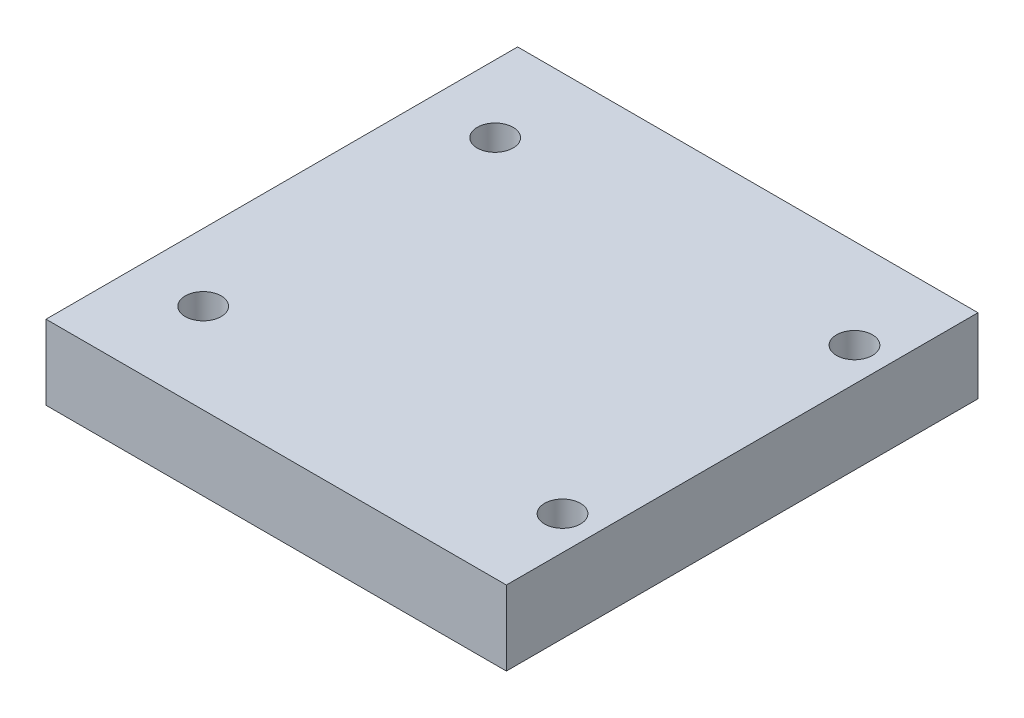
ISO-10303-21;
HEADER;
FILE_DESCRIPTION(('STEP AP214'),'2;1');
FILE_NAME('part.step','',(''),(''),'','','');
FILE_SCHEMA(('AUTOMOTIVE_DESIGN { 1 0 10303 214 1 1 1 1 }'));
ENDSEC;
DATA;
#1=APPLICATION_CONTEXT('core data for automotive mechanical design processes');
#2=APPLICATION_PROTOCOL_DEFINITION('international standard','automotive_design',2000,#1);
#3=PRODUCT_CONTEXT('',#1,'mechanical');
#4=PRODUCT('Part','Part','',(#3));
#5=PRODUCT_RELATED_PRODUCT_CATEGORY('part','',(#4));
#6=PRODUCT_DEFINITION_FORMATION('','',#4);
#7=PRODUCT_DEFINITION_CONTEXT('part definition',#1,'design');
#8=PRODUCT_DEFINITION('design','',#6,#7);
#9=PRODUCT_DEFINITION_SHAPE('','',#8);
#10=(LENGTH_UNIT() NAMED_UNIT(*) SI_UNIT(.MILLI.,.METRE.));
#11=(NAMED_UNIT(*) PLANE_ANGLE_UNIT() SI_UNIT($,.RADIAN.));
#12=(NAMED_UNIT(*) SI_UNIT($,.STERADIAN.) SOLID_ANGLE_UNIT());
#13=UNCERTAINTY_MEASURE_WITH_UNIT(LENGTH_MEASURE(1.E-05),#10,'distance_accuracy_value','');
#14=(GEOMETRIC_REPRESENTATION_CONTEXT(3) GLOBAL_UNCERTAINTY_ASSIGNED_CONTEXT((#13)) GLOBAL_UNIT_ASSIGNED_CONTEXT((#10,
#11,#12)) REPRESENTATION_CONTEXT('',''));
#15=CARTESIAN_POINT('',(0.,0.,0.));
#16=DIRECTION('',(0.,0.,1.));
#17=DIRECTION('',(1.,0.,0.));
#18=AXIS2_PLACEMENT_3D('',#15,#16,#17);
#19=CARTESIAN_POINT('',(-59.517248692373,10.541,24.9252097023032));
#20=DIRECTION('',(1.,0.,0.));
#21=DIRECTION('',(0.,0.,-1.));
#22=AXIS2_PLACEMENT_3D('',#19,#20,#21);
#23=PLANE('',#22);
#24=DIRECTION('',(0.,0.,1.));
#25=VECTOR('',#24,1.);
#26=CARTESIAN_POINT('',(-59.517248692373,0.,24.9252097023032));
#27=LINE('',#26,#25);
#28=CARTESIAN_POINT('',(-59.517248692373,0.,-41.7497902976968));
#29=VERTEX_POINT('',#28);
#30=CARTESIAN_POINT('',(-59.517248692373,0.,24.9252097023032));
#31=VERTEX_POINT('',#30);
#32=EDGE_CURVE('E96',#29,#31,#27,.T.);
#33=ORIENTED_EDGE('',*,*,#32,.T.);
#34=DIRECTION('',(0.,-1.,0.));
#35=VECTOR('',#34,1.);
#36=CARTESIAN_POINT('',(-59.517248692373,10.541,24.9252097023032));
#37=LINE('',#36,#35);
#38=CARTESIAN_POINT('',(-59.517248692373,10.541,24.9252097023032));
#39=VERTEX_POINT('',#38);
#40=EDGE_CURVE('E11',#39,#31,#37,.T.);
#41=ORIENTED_EDGE('',*,*,#40,.F.);
#42=DIRECTION('',(0.,0.,1.));
#43=VECTOR('',#42,1.);
#44=CARTESIAN_POINT('',(-59.517248692373,10.541,24.9252097023032));
#45=LINE('',#44,#43);
#46=CARTESIAN_POINT('',(-59.517248692373,10.541,-41.7497902976968));
#47=VERTEX_POINT('',#46);
#48=EDGE_CURVE('E84',#47,#39,#45,.T.);
#49=ORIENTED_EDGE('',*,*,#48,.F.);
#50=DIRECTION('',(0.,-1.,0.));
#51=VECTOR('',#50,1.);
#52=CARTESIAN_POINT('',(-59.517248692373,10.541,-41.7497902976968));
#53=LINE('',#52,#51);
#54=EDGE_CURVE('E92',#47,#29,#53,.T.);
#55=ORIENTED_EDGE('',*,*,#54,.T.);
#56=EDGE_LOOP('',(#33,#41,#49,#55));
#57=FACE_BOUND('',#56,.T.);
#58=ADVANCED_FACE('F33',(#57),#23,.F.);
#59=CARTESIAN_POINT('',(-59.517248692373,10.541,24.9252097023032));
#60=DIRECTION('',(0.,0.,-1.));
#61=DIRECTION('',(-1.,0.,0.));
#62=AXIS2_PLACEMENT_3D('',#59,#60,#61);
#63=PLANE('',#62);
#64=DIRECTION('',(1.,0.,0.));
#65=VECTOR('',#64,1.);
#66=CARTESIAN_POINT('',(-59.517248692373,0.,24.9252097023032));
#67=LINE('',#66,#65);
#68=CARTESIAN_POINT('',(5.57025130762703,0.,24.9252097023032));
#69=VERTEX_POINT('',#68);
#70=EDGE_CURVE('E88',#31,#69,#67,.T.);
#71=ORIENTED_EDGE('',*,*,#70,.T.);
#72=DIRECTION('',(0.,-1.,0.));
#73=VECTOR('',#72,1.);
#74=CARTESIAN_POINT('',(5.57025130762703,10.541,24.9252097023032));
#75=LINE('',#74,#73);
#76=CARTESIAN_POINT('',(5.57025130762703,10.541,24.9252097023032));
#77=VERTEX_POINT('',#76);
#78=EDGE_CURVE('E41',#77,#69,#75,.T.);
#79=ORIENTED_EDGE('',*,*,#78,.F.);
#80=DIRECTION('',(1.,0.,0.));
#81=VECTOR('',#80,1.);
#82=CARTESIAN_POINT('',(-59.517248692373,10.541,24.9252097023032));
#83=LINE('',#82,#81);
#84=EDGE_CURVE('E79',#39,#77,#83,.T.);
#85=ORIENTED_EDGE('',*,*,#84,.F.);
#86=ORIENTED_EDGE('',*,*,#40,.T.);
#87=EDGE_LOOP('',(#71,#79,#85,#86));
#88=FACE_BOUND('',#87,.T.);
#89=ADVANCED_FACE('F87',(#88),#63,.F.);
#90=CARTESIAN_POINT('',(5.57025130762703,10.541,24.9252097023032));
#91=DIRECTION('',(-1.,0.,0.));
#92=DIRECTION('',(0.,0.,1.));
#93=AXIS2_PLACEMENT_3D('',#90,#91,#92);
#94=PLANE('',#93);
#95=DIRECTION('',(0.,0.,-1.));
#96=VECTOR('',#95,1.);
#97=CARTESIAN_POINT('',(5.57025130762703,0.,24.9252097023032));
#98=LINE('',#97,#96);
#99=CARTESIAN_POINT('',(5.57025130762703,0.,-41.7497902976968));
#100=VERTEX_POINT('',#99);
#101=EDGE_CURVE('E66',#69,#100,#98,.T.);
#102=ORIENTED_EDGE('',*,*,#101,.T.);
#103=DIRECTION('',(0.,-1.,0.));
#104=VECTOR('',#103,1.);
#105=CARTESIAN_POINT('',(5.57025130762703,10.541,-41.7497902976968));
#106=LINE('',#105,#104);
#107=CARTESIAN_POINT('',(5.57025130762703,10.541,-41.7497902976968));
#108=VERTEX_POINT('',#107);
#109=EDGE_CURVE('E89',#108,#100,#106,.T.);
#110=ORIENTED_EDGE('',*,*,#109,.F.);
#111=DIRECTION('',(0.,0.,-1.));
#112=VECTOR('',#111,1.);
#113=CARTESIAN_POINT('',(5.57025130762703,10.541,24.9252097023032));
#114=LINE('',#113,#112);
#115=EDGE_CURVE('E82',#77,#108,#114,.T.);
#116=ORIENTED_EDGE('',*,*,#115,.F.);
#117=ORIENTED_EDGE('',*,*,#78,.T.);
#118=EDGE_LOOP('',(#102,#110,#116,#117));
#119=FACE_BOUND('',#118,.T.);
#120=ADVANCED_FACE('F90',(#119),#94,.F.);
#121=CARTESIAN_POINT('',(-59.517248692373,10.541,-41.7497902976968));
#122=DIRECTION('',(0.,0.,1.));
#123=DIRECTION('',(1.,0.,0.));
#124=AXIS2_PLACEMENT_3D('',#121,#122,#123);
#125=PLANE('',#124);
#126=DIRECTION('',(-1.,0.,0.));
#127=VECTOR('',#126,1.);
#128=CARTESIAN_POINT('',(-59.517248692373,0.,-41.7497902976968));
#129=LINE('',#128,#127);
#130=EDGE_CURVE('E72',#100,#29,#129,.T.);
#131=ORIENTED_EDGE('',*,*,#130,.T.);
#132=ORIENTED_EDGE('',*,*,#54,.F.);
#133=DIRECTION('',(-1.,0.,0.));
#134=VECTOR('',#133,1.);
#135=CARTESIAN_POINT('',(-59.517248692373,10.541,-41.7497902976968));
#136=LINE('',#135,#134);
#137=EDGE_CURVE('E49',#108,#47,#136,.T.);
#138=ORIENTED_EDGE('',*,*,#137,.F.);
#139=ORIENTED_EDGE('',*,*,#109,.T.);
#140=EDGE_LOOP('',(#131,#132,#138,#139));
#141=FACE_BOUND('',#140,.T.);
#142=ADVANCED_FACE('F104',(#141),#125,.F.);
#143=CARTESIAN_POINT('',(0.,10.541,0.));
#144=DIRECTION('',(0.,-1.,0.));
#145=DIRECTION('',(0.,0.,-1.));
#146=AXIS2_PLACEMENT_3D('',#143,#144,#145);
#147=PLANE('',#146);
#148=CARTESIAN_POINT('',(0.807751307627037,10.541,-29.0497902976968));
#149=DIRECTION('',(0.,-1.,0.));
#150=DIRECTION('',(0.,0.,-1.));
#151=AXIS2_PLACEMENT_3D('',#148,#149,#150);
#152=CIRCLE('',#151,2.54);
#153=CARTESIAN_POINT('',(0.807751307627037,10.541,-31.5897902976968));
#154=VERTEX_POINT('',#153);
#155=EDGE_CURVE('E99',#154,#154,#152,.T.);
#156=ORIENTED_EDGE('',*,*,#155,.T.);
#157=EDGE_LOOP('',(#156));
#158=FACE_BOUND('',#157,.T.);
#159=CARTESIAN_POINT('',(-49.992248692373,10.541,12.2252097023032));
#160=DIRECTION('',(0.,-1.,0.));
#161=DIRECTION('',(0.,0.,-1.));
#162=AXIS2_PLACEMENT_3D('',#159,#160,#161);
#163=CIRCLE('',#162,2.54);
#164=CARTESIAN_POINT('',(-49.992248692373,10.541,9.68520970230316));
#165=VERTEX_POINT('',#164);
#166=EDGE_CURVE('E112',#165,#165,#163,.T.);
#167=ORIENTED_EDGE('',*,*,#166,.T.);
#168=EDGE_LOOP('',(#167));
#169=FACE_BOUND('',#168,.T.);
#170=CARTESIAN_POINT('',(0.807751307627037,10.541,12.2252097023032));
#171=DIRECTION('',(0.,-1.,0.));
#172=DIRECTION('',(0.,0.,-1.));
#173=AXIS2_PLACEMENT_3D('',#170,#171,#172);
#174=CIRCLE('',#173,2.54);
#175=CARTESIAN_POINT('',(0.807751307627037,10.541,9.68520970230316));
#176=VERTEX_POINT('',#175);
#177=EDGE_CURVE('E115',#176,#176,#174,.T.);
#178=ORIENTED_EDGE('',*,*,#177,.T.);
#179=EDGE_LOOP('',(#178));
#180=FACE_BOUND('',#179,.T.);
#181=CARTESIAN_POINT('',(-49.992248692373,10.541,-29.0497902976968));
#182=DIRECTION('',(0.,-1.,0.));
#183=DIRECTION('',(0.,0.,-1.));
#184=AXIS2_PLACEMENT_3D('',#181,#182,#183);
#185=CIRCLE('',#184,2.54);
#186=CARTESIAN_POINT('',(-49.992248692373,10.541,-31.5897902976968));
#187=VERTEX_POINT('',#186);
#188=EDGE_CURVE('E118',#187,#187,#185,.T.);
#189=ORIENTED_EDGE('',*,*,#188,.T.);
#190=EDGE_LOOP('',(#189));
#191=FACE_BOUND('',#190,.T.);
#192=ORIENTED_EDGE('',*,*,#48,.T.);
#193=ORIENTED_EDGE('',*,*,#84,.T.);
#194=ORIENTED_EDGE('',*,*,#115,.T.);
#195=ORIENTED_EDGE('',*,*,#137,.T.);
#196=EDGE_LOOP('',(#192,#193,#194,#195));
#197=FACE_BOUND('',#196,.T.);
#198=ADVANCED_FACE('F80',(#158,#169,#180,#191,#197),#147,.F.);
#199=CARTESIAN_POINT('',(0.,0.,0.));
#200=DIRECTION('',(0.,-1.,0.));
#201=DIRECTION('',(0.,0.,-1.));
#202=AXIS2_PLACEMENT_3D('',#199,#200,#201);
#203=PLANE('',#202);
#204=CARTESIAN_POINT('',(0.807751307627037,0.,-29.0497902976968));
#205=DIRECTION('',(0.,1.,0.));
#206=DIRECTION('',(0.,0.,1.));
#207=AXIS2_PLACEMENT_3D('',#204,#205,#206);
#208=CIRCLE('',#207,2.54);
#209=CARTESIAN_POINT('',(0.807751307627037,0.,-26.5097902976968));
#210=VERTEX_POINT('',#209);
#211=EDGE_CURVE('E124',#210,#210,#208,.T.);
#212=ORIENTED_EDGE('',*,*,#211,.T.);
#213=EDGE_LOOP('',(#212));
#214=FACE_BOUND('',#213,.T.);
#215=CARTESIAN_POINT('',(-49.992248692373,0.,12.2252097023032));
#216=DIRECTION('',(0.,1.,0.));
#217=DIRECTION('',(0.,0.,1.));
#218=AXIS2_PLACEMENT_3D('',#215,#216,#217);
#219=CIRCLE('',#218,2.54);
#220=CARTESIAN_POINT('',(-49.992248692373,0.,14.7652097023032));
#221=VERTEX_POINT('',#220);
#222=EDGE_CURVE('E125',#221,#221,#219,.T.);
#223=ORIENTED_EDGE('',*,*,#222,.T.);
#224=EDGE_LOOP('',(#223));
#225=FACE_BOUND('',#224,.T.);
#226=CARTESIAN_POINT('',(0.807751307627037,0.,12.2252097023032));
#227=DIRECTION('',(0.,1.,0.));
#228=DIRECTION('',(0.,0.,1.));
#229=AXIS2_PLACEMENT_3D('',#226,#227,#228);
#230=CIRCLE('',#229,2.54);
#231=CARTESIAN_POINT('',(0.807751307627037,0.,14.7652097023032));
#232=VERTEX_POINT('',#231);
#233=EDGE_CURVE('E128',#232,#232,#230,.T.);
#234=ORIENTED_EDGE('',*,*,#233,.T.);
#235=EDGE_LOOP('',(#234));
#236=FACE_BOUND('',#235,.T.);
#237=CARTESIAN_POINT('',(-49.992248692373,0.,-29.0497902976968));
#238=DIRECTION('',(0.,1.,0.));
#239=DIRECTION('',(0.,0.,1.));
#240=AXIS2_PLACEMENT_3D('',#237,#238,#239);
#241=CIRCLE('',#240,2.54);
#242=CARTESIAN_POINT('',(-49.992248692373,0.,-26.5097902976968));
#243=VERTEX_POINT('',#242);
#244=EDGE_CURVE('E121',#243,#243,#241,.T.);
#245=ORIENTED_EDGE('',*,*,#244,.T.);
#246=EDGE_LOOP('',(#245));
#247=FACE_BOUND('',#246,.T.);
#248=ORIENTED_EDGE('',*,*,#32,.F.);
#249=ORIENTED_EDGE('',*,*,#130,.F.);
#250=ORIENTED_EDGE('',*,*,#101,.F.);
#251=ORIENTED_EDGE('',*,*,#70,.F.);
#252=EDGE_LOOP('',(#248,#249,#250,#251));
#253=FACE_BOUND('',#252,.T.);
#254=ADVANCED_FACE('F107',(#214,#225,#236,#247,#253),#203,.T.);
#255=CARTESIAN_POINT('',(-49.992248692373,0.,-29.0497902976968));
#256=DIRECTION('',(0.,1.,0.));
#257=DIRECTION('',(0.,0.,1.));
#258=AXIS2_PLACEMENT_3D('',#255,#256,#257);
#259=CYLINDRICAL_SURFACE('',#258,2.54);
#260=ORIENTED_EDGE('',*,*,#244,.F.);
#261=EDGE_LOOP('',(#260));
#262=FACE_BOUND('',#261,.T.);
#263=ORIENTED_EDGE('',*,*,#188,.F.);
#264=EDGE_LOOP('',(#263));
#265=FACE_BOUND('',#264,.T.);
#266=ADVANCED_FACE('F140',(#262,#265),#259,.F.);
#267=CARTESIAN_POINT('',(0.807751307627037,0.,12.2252097023032));
#268=DIRECTION('',(0.,1.,0.));
#269=DIRECTION('',(0.,0.,1.));
#270=AXIS2_PLACEMENT_3D('',#267,#268,#269);
#271=CYLINDRICAL_SURFACE('',#270,2.54);
#272=ORIENTED_EDGE('',*,*,#233,.F.);
#273=EDGE_LOOP('',(#272));
#274=FACE_BOUND('',#273,.T.);
#275=ORIENTED_EDGE('',*,*,#177,.F.);
#276=EDGE_LOOP('',(#275));
#277=FACE_BOUND('',#276,.T.);
#278=ADVANCED_FACE('F136',(#274,#277),#271,.F.);
#279=CARTESIAN_POINT('',(-49.992248692373,0.,12.2252097023032));
#280=DIRECTION('',(0.,1.,0.));
#281=DIRECTION('',(0.,0.,1.));
#282=AXIS2_PLACEMENT_3D('',#279,#280,#281);
#283=CYLINDRICAL_SURFACE('',#282,2.54);
#284=ORIENTED_EDGE('',*,*,#222,.F.);
#285=EDGE_LOOP('',(#284));
#286=FACE_BOUND('',#285,.T.);
#287=ORIENTED_EDGE('',*,*,#166,.F.);
#288=EDGE_LOOP('',(#287));
#289=FACE_BOUND('',#288,.T.);
#290=ADVANCED_FACE('F139',(#286,#289),#283,.F.);
#291=CARTESIAN_POINT('',(0.807751307627037,0.,-29.0497902976968));
#292=DIRECTION('',(0.,1.,0.));
#293=DIRECTION('',(0.,0.,1.));
#294=AXIS2_PLACEMENT_3D('',#291,#292,#293);
#295=CYLINDRICAL_SURFACE('',#294,2.54);
#296=ORIENTED_EDGE('',*,*,#211,.F.);
#297=EDGE_LOOP('',(#296));
#298=FACE_BOUND('',#297,.T.);
#299=ORIENTED_EDGE('',*,*,#155,.F.);
#300=EDGE_LOOP('',(#299));
#301=FACE_BOUND('',#300,.T.);
#302=ADVANCED_FACE('F201',(#298,#301),#295,.F.);
#303=CLOSED_SHELL('',(#58,#89,#120,#142,#198,#254,#266,#278,#290,#302));
#304=MANIFOLD_SOLID_BREP('B2',#303);
#305=ADVANCED_BREP_SHAPE_REPRESENTATION('',(#18,#304),#14);
#306=SHAPE_DEFINITION_REPRESENTATION(#9,#305);
ENDSEC;
END-ISO-10303-21;
